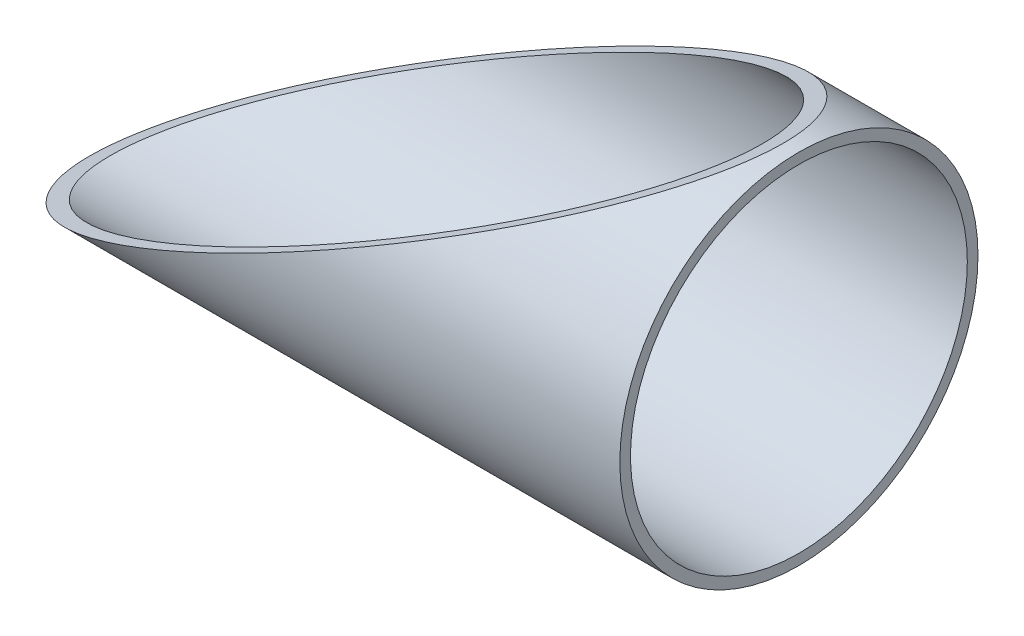
ISO-10303-21;
HEADER;
FILE_DESCRIPTION(('STEP AP214'),'2;1');
FILE_NAME('part.step','',(''),(''),'','','');
FILE_SCHEMA(('AUTOMOTIVE_DESIGN { 1 0 10303 214 1 1 1 1 }'));
ENDSEC;
DATA;
#1=APPLICATION_CONTEXT('core data for automotive mechanical design processes');
#2=APPLICATION_PROTOCOL_DEFINITION('international standard','automotive_design',2000,#1);
#3=PRODUCT_CONTEXT('',#1,'mechanical');
#4=PRODUCT('Part','Part','',(#3));
#5=PRODUCT_RELATED_PRODUCT_CATEGORY('part','',(#4));
#6=PRODUCT_DEFINITION_FORMATION('','',#4);
#7=PRODUCT_DEFINITION_CONTEXT('part definition',#1,'design');
#8=PRODUCT_DEFINITION('design','',#6,#7);
#9=PRODUCT_DEFINITION_SHAPE('','',#8);
#10=(LENGTH_UNIT() NAMED_UNIT(*) SI_UNIT(.MILLI.,.METRE.));
#11=(NAMED_UNIT(*) PLANE_ANGLE_UNIT() SI_UNIT($,.RADIAN.));
#12=(NAMED_UNIT(*) SI_UNIT($,.STERADIAN.) SOLID_ANGLE_UNIT());
#13=UNCERTAINTY_MEASURE_WITH_UNIT(LENGTH_MEASURE(1.E-05),#10,'distance_accuracy_value','');
#14=(GEOMETRIC_REPRESENTATION_CONTEXT(3) GLOBAL_UNCERTAINTY_ASSIGNED_CONTEXT((#13)) GLOBAL_UNIT_ASSIGNED_CONTEXT((#10,
#11,#12)) REPRESENTATION_CONTEXT('',''));
#15=CARTESIAN_POINT('',(0.,0.,0.));
#16=DIRECTION('',(0.,0.,1.));
#17=DIRECTION('',(1.,0.,0.));
#18=AXIS2_PLACEMENT_3D('',#15,#16,#17);
#19=CARTESIAN_POINT('',(1.37592875931075,-2.66586197116458,0.));
#20=DIRECTION('',(-0.458642919770252,0.888620657054864,0.));
#21=DIRECTION('',(-0.888620657054864,-0.458642919770252,0.));
#22=AXIS2_PLACEMENT_3D('',#19,#20,#21);
#23=PLANE('',#22);
#24=CARTESIAN_POINT('',(43.3535363284421,19.,111.));
#25=DIRECTION('',(0.458642919770252,-0.888620657054864,0.));
#26=DIRECTION('',(-0.888620657054864,-0.458642919770252,0.));
#27=AXIS2_PLACEMENT_3D('',#24,#25,#26);
#28=ELLIPSE('',#27,19.0108973677658,8.7192134762047);
#29=CARTESIAN_POINT('',(26.4600602182955,10.2807865237953,111.));
#30=VERTEX_POINT('',#29);
#31=EDGE_CURVE('E38',#30,#30,#28,.F.);
#32=ORIENTED_EDGE('',*,*,#31,.T.);
#33=EDGE_LOOP('',(#32));
#34=FACE_BOUND('',#33,.T.);
#35=CARTESIAN_POINT('',(43.3535363284421,19.,111.));
#36=DIRECTION('',(-0.458642919770252,0.888620657054864,0.));
#37=DIRECTION('',(-0.888620657054864,-0.458642919770252,0.));
#38=AXIS2_PLACEMENT_3D('',#35,#36,#37);
#39=ELLIPSE('',#38,17.8788326310752,8.2);
#40=CARTESIAN_POINT('',(27.4660363284421,10.8,111.));
#41=VERTEX_POINT('',#40);
#42=EDGE_CURVE('E47',#41,#41,#39,.T.);
#43=ORIENTED_EDGE('',*,*,#42,.F.);
#44=EDGE_LOOP('',(#43));
#45=FACE_BOUND('',#44,.T.);
#46=ADVANCED_FACE('F35',(#34,#45),#23,.T.);
#47=CARTESIAN_POINT('',(61.,19.,111.));
#48=DIRECTION('',(-1.,0.,0.));
#49=DIRECTION('',(0.,0.,1.));
#50=AXIS2_PLACEMENT_3D('',#47,#48,#49);
#51=CYLINDRICAL_SURFACE('',#50,8.2);
#52=CARTESIAN_POINT('',(61.,19.,111.));
#53=DIRECTION('',(1.,0.,0.));
#54=DIRECTION('',(0.,0.,-1.));
#55=AXIS2_PLACEMENT_3D('',#52,#53,#54);
#56=CIRCLE('',#55,8.2);
#57=CARTESIAN_POINT('',(61.,19.,102.8));
#58=VERTEX_POINT('',#57);
#59=EDGE_CURVE('E10',#58,#58,#56,.T.);
#60=ORIENTED_EDGE('',*,*,#59,.T.);
#61=EDGE_LOOP('',(#60));
#62=FACE_BOUND('',#61,.T.);
#63=ORIENTED_EDGE('',*,*,#42,.T.);
#64=EDGE_LOOP('',(#63));
#65=FACE_BOUND('',#64,.T.);
#66=ADVANCED_FACE('F66',(#62,#65),#51,.F.);
#67=CARTESIAN_POINT('',(61.,19.,111.));
#68=DIRECTION('',(1.,0.,0.));
#69=DIRECTION('',(0.,0.,-1.));
#70=AXIS2_PLACEMENT_3D('',#67,#68,#69);
#71=PLANE('',#70);
#72=CARTESIAN_POINT('',(61.,19.,111.));
#73=DIRECTION('',(1.,0.,0.));
#74=DIRECTION('',(0.,0.,-1.));
#75=AXIS2_PLACEMENT_3D('',#72,#73,#74);
#76=CIRCLE('',#75,8.7192134762047);
#77=CARTESIAN_POINT('',(61.,19.,102.280786523795));
#78=VERTEX_POINT('',#77);
#79=EDGE_CURVE('E42',#78,#78,#76,.T.);
#80=ORIENTED_EDGE('',*,*,#79,.T.);
#81=EDGE_LOOP('',(#80));
#82=FACE_BOUND('',#81,.T.);
#83=ORIENTED_EDGE('',*,*,#59,.F.);
#84=EDGE_LOOP('',(#83));
#85=FACE_BOUND('',#84,.T.);
#86=ADVANCED_FACE('F60',(#82,#85),#71,.T.);
#87=CARTESIAN_POINT('',(61.,19.,111.));
#88=DIRECTION('',(-1.,0.,0.));
#89=DIRECTION('',(0.,0.,1.));
#90=AXIS2_PLACEMENT_3D('',#87,#88,#89);
#91=CYLINDRICAL_SURFACE('',#90,8.7192134762047);
#92=ORIENTED_EDGE('',*,*,#31,.F.);
#93=EDGE_LOOP('',(#92));
#94=FACE_BOUND('',#93,.T.);
#95=ORIENTED_EDGE('',*,*,#79,.F.);
#96=EDGE_LOOP('',(#95));
#97=FACE_BOUND('',#96,.T.);
#98=ADVANCED_FACE('F57',(#94,#97),#91,.T.);
#99=CLOSED_SHELL('',(#46,#66,#86,#98));
#100=MANIFOLD_SOLID_BREP('B2',#99);
#101=ADVANCED_BREP_SHAPE_REPRESENTATION('',(#18,#100),#14);
#102=SHAPE_DEFINITION_REPRESENTATION(#9,#101);
ENDSEC;
END-ISO-10303-21;
